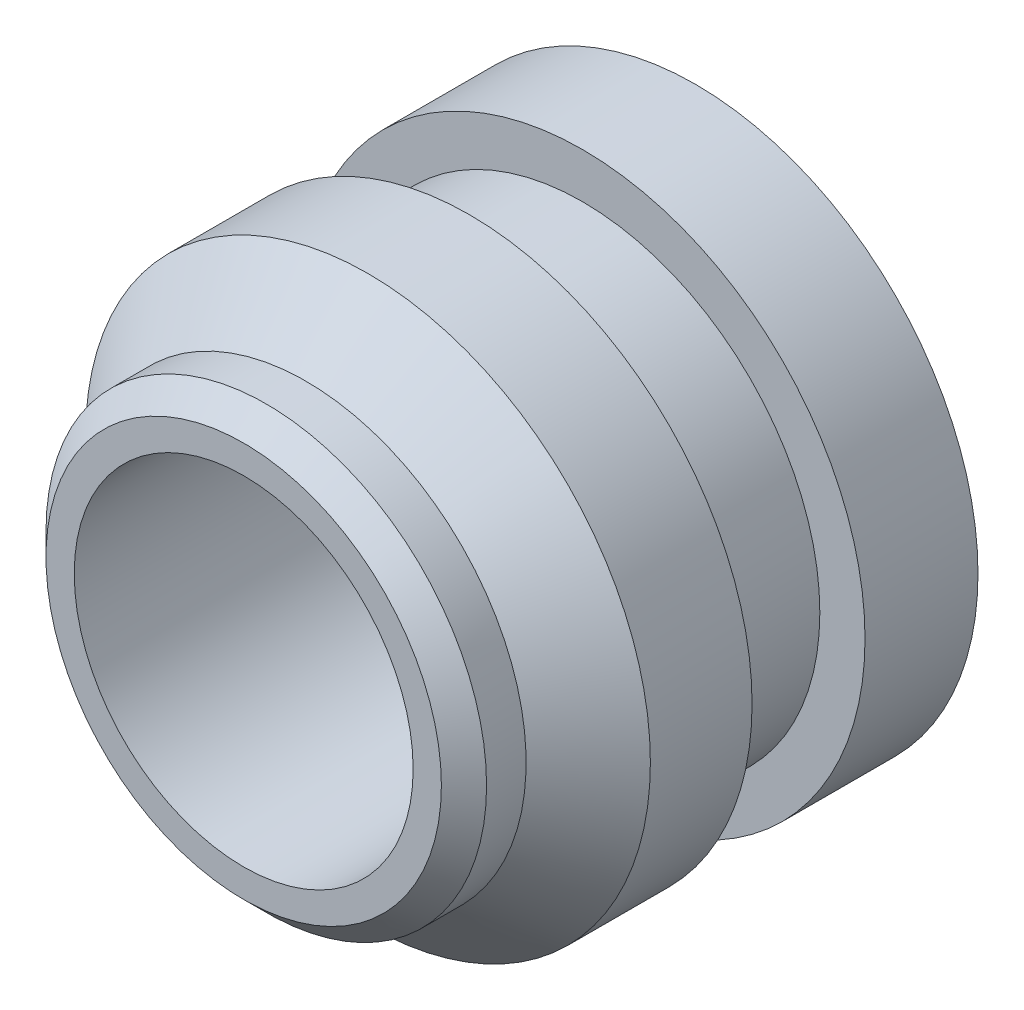
ISO-10303-21;
HEADER;
FILE_DESCRIPTION(('STEP AP214'),'2;1');
FILE_NAME('part.step','',(''),(''),'','','');
FILE_SCHEMA(('AUTOMOTIVE_DESIGN { 1 0 10303 214 1 1 1 1 }'));
ENDSEC;
DATA;
#1=APPLICATION_CONTEXT('core data for automotive mechanical design processes');
#2=APPLICATION_PROTOCOL_DEFINITION('international standard','automotive_design',2000,#1);
#3=PRODUCT_CONTEXT('',#1,'mechanical');
#4=PRODUCT('Part','Part','',(#3));
#5=PRODUCT_RELATED_PRODUCT_CATEGORY('part','',(#4));
#6=PRODUCT_DEFINITION_FORMATION('','',#4);
#7=PRODUCT_DEFINITION_CONTEXT('part definition',#1,'design');
#8=PRODUCT_DEFINITION('design','',#6,#7);
#9=PRODUCT_DEFINITION_SHAPE('','',#8);
#10=(LENGTH_UNIT() NAMED_UNIT(*) SI_UNIT(.MILLI.,.METRE.));
#11=(NAMED_UNIT(*) PLANE_ANGLE_UNIT() SI_UNIT($,.RADIAN.));
#12=(NAMED_UNIT(*) SI_UNIT($,.STERADIAN.) SOLID_ANGLE_UNIT());
#13=UNCERTAINTY_MEASURE_WITH_UNIT(LENGTH_MEASURE(1.E-05),#10,'distance_accuracy_value','');
#14=(GEOMETRIC_REPRESENTATION_CONTEXT(3) GLOBAL_UNCERTAINTY_ASSIGNED_CONTEXT((#13)) GLOBAL_UNIT_ASSIGNED_CONTEXT((#10,
#11,#12)) REPRESENTATION_CONTEXT('',''));
#15=CARTESIAN_POINT('',(0.,0.,0.));
#16=DIRECTION('',(0.,0.,1.));
#17=DIRECTION('',(1.,0.,0.));
#18=AXIS2_PLACEMENT_3D('',#15,#16,#17);
#19=CARTESIAN_POINT('',(0.,0.,1.));
#20=DIRECTION('',(0.,0.,-1.));
#21=DIRECTION('',(-1.,0.,0.));
#22=AXIS2_PLACEMENT_3D('',#19,#20,#21);
#23=CYLINDRICAL_SURFACE('',#22,2.5);
#24=CARTESIAN_POINT('',(0.,0.,1.));
#25=DIRECTION('',(0.,0.,1.));
#26=DIRECTION('',(1.,0.,0.));
#27=AXIS2_PLACEMENT_3D('',#24,#25,#26);
#28=CIRCLE('',#27,2.5);
#29=CARTESIAN_POINT('',(2.5,0.,1.));
#30=VERTEX_POINT('',#29);
#31=EDGE_CURVE('E41',#30,#30,#28,.T.);
#32=ORIENTED_EDGE('',*,*,#31,.F.);
#33=EDGE_LOOP('',(#32));
#34=FACE_BOUND('',#33,.T.);
#35=CARTESIAN_POINT('',(0.,0.,0.));
#36=DIRECTION('',(0.,0.,1.));
#37=DIRECTION('',(1.,0.,0.));
#38=AXIS2_PLACEMENT_3D('',#35,#36,#37);
#39=CIRCLE('',#38,2.5);
#40=CARTESIAN_POINT('',(2.5,0.,0.));
#41=VERTEX_POINT('',#40);
#42=EDGE_CURVE('E45',#41,#41,#39,.T.);
#43=ORIENTED_EDGE('',*,*,#42,.T.);
#44=EDGE_LOOP('',(#43));
#45=FACE_BOUND('',#44,.T.);
#46=ADVANCED_FACE('F15',(#34,#45),#23,.T.);
#47=CARTESIAN_POINT('',(0.,0.,1.));
#48=DIRECTION('',(0.,0.,1.));
#49=DIRECTION('',(1.,0.,0.));
#50=AXIS2_PLACEMENT_3D('',#47,#48,#49);
#51=PLANE('',#50);
#52=CARTESIAN_POINT('',(0.,0.,1.));
#53=DIRECTION('',(0.,0.,1.));
#54=DIRECTION('',(1.,0.,0.));
#55=AXIS2_PLACEMENT_3D('',#52,#53,#54);
#56=CIRCLE('',#55,2.1);
#57=CARTESIAN_POINT('',(2.1,0.,1.));
#58=VERTEX_POINT('',#57);
#59=EDGE_CURVE('E48',#58,#58,#56,.T.);
#60=ORIENTED_EDGE('',*,*,#59,.F.);
#61=EDGE_LOOP('',(#60));
#62=FACE_BOUND('',#61,.T.);
#63=ORIENTED_EDGE('',*,*,#31,.T.);
#64=EDGE_LOOP('',(#63));
#65=FACE_BOUND('',#64,.T.);
#66=ADVANCED_FACE('F78',(#62,#65),#51,.T.);
#67=CARTESIAN_POINT('',(0.,0.,0.));
#68=DIRECTION('',(0.,0.,1.));
#69=DIRECTION('',(1.,0.,0.));
#70=AXIS2_PLACEMENT_3D('',#67,#68,#69);
#71=PLANE('',#70);
#72=CARTESIAN_POINT('',(0.,0.,0.));
#73=DIRECTION('',(0.,0.,1.));
#74=DIRECTION('',(1.,0.,0.));
#75=AXIS2_PLACEMENT_3D('',#72,#73,#74);
#76=CIRCLE('',#75,2.07735026918962);
#77=CARTESIAN_POINT('',(2.07735026918962,0.,0.));
#78=VERTEX_POINT('',#77);
#79=EDGE_CURVE('E22',#78,#78,#76,.T.);
#80=ORIENTED_EDGE('',*,*,#79,.T.);
#81=EDGE_LOOP('',(#80));
#82=FACE_BOUND('',#81,.T.);
#83=ORIENTED_EDGE('',*,*,#42,.F.);
#84=EDGE_LOOP('',(#83));
#85=FACE_BOUND('',#84,.T.);
#86=ADVANCED_FACE('F88',(#82,#85),#71,.F.);
#87=CARTESIAN_POINT('',(0.,0.,2.));
#88=DIRECTION('',(0.,0.,-1.));
#89=DIRECTION('',(-1.,0.,0.));
#90=AXIS2_PLACEMENT_3D('',#87,#88,#89);
#91=CYLINDRICAL_SURFACE('',#90,2.1);
#92=CARTESIAN_POINT('',(0.,0.,2.));
#93=DIRECTION('',(0.,0.,1.));
#94=DIRECTION('',(1.,0.,0.));
#95=AXIS2_PLACEMENT_3D('',#92,#93,#94);
#96=CIRCLE('',#95,2.1);
#97=CARTESIAN_POINT('',(2.1,0.,2.));
#98=VERTEX_POINT('',#97);
#99=EDGE_CURVE('E44',#98,#98,#96,.T.);
#100=ORIENTED_EDGE('',*,*,#99,.F.);
#101=EDGE_LOOP('',(#100));
#102=FACE_BOUND('',#101,.T.);
#103=ORIENTED_EDGE('',*,*,#59,.T.);
#104=EDGE_LOOP('',(#103));
#105=FACE_BOUND('',#104,.T.);
#106=ADVANCED_FACE('F111',(#102,#105),#91,.T.);
#107=CARTESIAN_POINT('',(0.,0.,3.5));
#108=DIRECTION('',(0.,0.,-1.));
#109=DIRECTION('',(-1.,0.,0.));
#110=AXIS2_PLACEMENT_3D('',#107,#108,#109);
#111=CYLINDRICAL_SURFACE('',#110,2.5);
#112=CARTESIAN_POINT('',(0.,0.,2.9));
#113=DIRECTION('',(0.,0.,1.));
#114=DIRECTION('',(1.,0.,0.));
#115=AXIS2_PLACEMENT_3D('',#112,#113,#114);
#116=CIRCLE('',#115,2.5);
#117=CARTESIAN_POINT('',(2.5,0.,2.9));
#118=VERTEX_POINT('',#117);
#119=EDGE_CURVE('E28',#118,#118,#116,.F.);
#120=ORIENTED_EDGE('',*,*,#119,.T.);
#121=EDGE_LOOP('',(#120));
#122=FACE_BOUND('',#121,.T.);
#123=CARTESIAN_POINT('',(0.,0.,2.));
#124=DIRECTION('',(0.,0.,1.));
#125=DIRECTION('',(1.,0.,0.));
#126=AXIS2_PLACEMENT_3D('',#123,#124,#125);
#127=CIRCLE('',#126,2.5);
#128=CARTESIAN_POINT('',(2.5,0.,2.));
#129=VERTEX_POINT('',#128);
#130=EDGE_CURVE('E51',#129,#129,#127,.T.);
#131=ORIENTED_EDGE('',*,*,#130,.T.);
#132=EDGE_LOOP('',(#131));
#133=FACE_BOUND('',#132,.T.);
#134=ADVANCED_FACE('F112',(#122,#133),#111,.T.);
#135=CARTESIAN_POINT('',(0.,0.,2.));
#136=DIRECTION('',(0.,0.,1.));
#137=DIRECTION('',(1.,0.,0.));
#138=AXIS2_PLACEMENT_3D('',#135,#136,#137);
#139=PLANE('',#138);
#140=ORIENTED_EDGE('',*,*,#99,.T.);
#141=EDGE_LOOP('',(#140));
#142=FACE_BOUND('',#141,.T.);
#143=ORIENTED_EDGE('',*,*,#130,.F.);
#144=EDGE_LOOP('',(#143));
#145=FACE_BOUND('',#144,.T.);
#146=ADVANCED_FACE('F74',(#142,#145),#139,.F.);
#147=CARTESIAN_POINT('',(0.,0.,4.));
#148=DIRECTION('',(0.,0.,-1.));
#149=DIRECTION('',(-1.,0.,0.));
#150=AXIS2_PLACEMENT_3D('',#147,#148,#149);
#151=CYLINDRICAL_SURFACE('',#150,1.95);
#152=CARTESIAN_POINT('',(0.,0.,3.45));
#153=DIRECTION('',(0.,0.,-1.));
#154=DIRECTION('',(-1.,0.,0.));
#155=AXIS2_PLACEMENT_3D('',#152,#153,#154);
#156=CIRCLE('',#155,1.95);
#157=CARTESIAN_POINT('',(-1.95,0.,3.45));
#158=VERTEX_POINT('',#157);
#159=EDGE_CURVE('E27',#158,#158,#156,.F.);
#160=ORIENTED_EDGE('',*,*,#159,.T.);
#161=EDGE_LOOP('',(#160));
#162=FACE_BOUND('',#161,.T.);
#163=CARTESIAN_POINT('',(0.,0.,3.8));
#164=DIRECTION('',(0.,0.,1.));
#165=DIRECTION('',(1.,0.,0.));
#166=AXIS2_PLACEMENT_3D('',#163,#164,#165);
#167=CIRCLE('',#166,1.95);
#168=CARTESIAN_POINT('',(1.95,0.,3.8));
#169=VERTEX_POINT('',#168);
#170=EDGE_CURVE('E34',#169,#169,#167,.F.);
#171=ORIENTED_EDGE('',*,*,#170,.T.);
#172=EDGE_LOOP('',(#171));
#173=FACE_BOUND('',#172,.T.);
#174=ADVANCED_FACE('F63',(#162,#173),#151,.T.);
#175=CARTESIAN_POINT('',(0.,0.,4.));
#176=DIRECTION('',(0.,0.,1.));
#177=DIRECTION('',(1.,0.,0.));
#178=AXIS2_PLACEMENT_3D('',#175,#176,#177);
#179=PLANE('',#178);
#180=CARTESIAN_POINT('',(0.,0.,4.));
#181=DIRECTION('',(0.,0.,1.));
#182=DIRECTION('',(1.,0.,0.));
#183=AXIS2_PLACEMENT_3D('',#180,#181,#182);
#184=CIRCLE('',#183,1.75);
#185=CARTESIAN_POINT('',(1.75,0.,4.));
#186=VERTEX_POINT('',#185);
#187=EDGE_CURVE('E36',#186,#186,#184,.T.);
#188=ORIENTED_EDGE('',*,*,#187,.T.);
#189=EDGE_LOOP('',(#188));
#190=FACE_BOUND('',#189,.T.);
#191=CARTESIAN_POINT('',(0.,0.,4.));
#192=DIRECTION('',(0.,0.,1.));
#193=DIRECTION('',(1.,0.,0.));
#194=AXIS2_PLACEMENT_3D('',#191,#192,#193);
#195=CIRCLE('',#194,1.5);
#196=CARTESIAN_POINT('',(1.5,0.,4.));
#197=VERTEX_POINT('',#196);
#198=EDGE_CURVE('E57',#197,#197,#195,.T.);
#199=ORIENTED_EDGE('',*,*,#198,.F.);
#200=EDGE_LOOP('',(#199));
#201=FACE_BOUND('',#200,.T.);
#202=ADVANCED_FACE('F62',(#190,#201),#179,.T.);
#203=CARTESIAN_POINT('',(0.,0.,0.));
#204=DIRECTION('',(0.,0.,1.));
#205=DIRECTION('',(1.,0.,0.));
#206=AXIS2_PLACEMENT_3D('',#203,#204,#205);
#207=CYLINDRICAL_SURFACE('',#206,1.5);
#208=CARTESIAN_POINT('',(0.,0.,1.));
#209=DIRECTION('',(0.,0.,1.));
#210=DIRECTION('',(1.,0.,0.));
#211=AXIS2_PLACEMENT_3D('',#208,#209,#210);
#212=CIRCLE('',#211,1.5);
#213=CARTESIAN_POINT('',(1.5,0.,1.));
#214=VERTEX_POINT('',#213);
#215=EDGE_CURVE('E10',#214,#214,#212,.F.);
#216=ORIENTED_EDGE('',*,*,#215,.T.);
#217=EDGE_LOOP('',(#216));
#218=FACE_BOUND('',#217,.T.);
#219=ORIENTED_EDGE('',*,*,#198,.T.);
#220=EDGE_LOOP('',(#219));
#221=FACE_BOUND('',#220,.T.);
#222=ADVANCED_FACE('F58',(#218,#221),#207,.F.);
#223=CARTESIAN_POINT('',(0.,0.,4.));
#224=DIRECTION('',(0.,0.,-1.));
#225=DIRECTION('',(-1.,0.,0.));
#226=AXIS2_PLACEMENT_3D('',#223,#224,#225);
#227=CONICAL_SURFACE('',#226,1.75,0.785398163397446);
#228=ORIENTED_EDGE('',*,*,#170,.F.);
#229=EDGE_LOOP('',(#228));
#230=FACE_BOUND('',#229,.T.);
#231=ORIENTED_EDGE('',*,*,#187,.F.);
#232=EDGE_LOOP('',(#231));
#233=FACE_BOUND('',#232,.T.);
#234=ADVANCED_FACE('F73',(#230,#233),#227,.T.);
#235=CARTESIAN_POINT('',(0.,0.,3.5));
#236=DIRECTION('',(0.,0.,-1.));
#237=DIRECTION('',(-1.,0.,0.));
#238=AXIS2_PLACEMENT_3D('',#235,#236,#237);
#239=CONICAL_SURFACE('',#238,1.9,0.785398163397453);
#240=ORIENTED_EDGE('',*,*,#119,.F.);
#241=EDGE_LOOP('',(#240));
#242=FACE_BOUND('',#241,.T.);
#243=ORIENTED_EDGE('',*,*,#159,.F.);
#244=EDGE_LOOP('',(#243));
#245=FACE_BOUND('',#244,.T.);
#246=ADVANCED_FACE('F94',(#242,#245),#239,.T.);
#247=CARTESIAN_POINT('',(0.,0.,0.));
#248=DIRECTION('',(0.,0.,-1.));
#249=DIRECTION('',(-1.,0.,0.));
#250=AXIS2_PLACEMENT_3D('',#247,#248,#249);
#251=CONICAL_SURFACE('',#250,2.07735026918962,0.523598775598298);
#252=ORIENTED_EDGE('',*,*,#215,.F.);
#253=EDGE_LOOP('',(#252));
#254=FACE_BOUND('',#253,.T.);
#255=ORIENTED_EDGE('',*,*,#79,.F.);
#256=EDGE_LOOP('',(#255));
#257=FACE_BOUND('',#256,.T.);
#258=ADVANCED_FACE('F17',(#254,#257),#251,.F.);
#259=CLOSED_SHELL('',(#46,#66,#86,#106,#134,#146,#174,#202,#222,#234,#246,#258));
#260=MANIFOLD_SOLID_BREP('B1',#259);
#261=ADVANCED_BREP_SHAPE_REPRESENTATION('',(#18,#260),#14);
#262=SHAPE_DEFINITION_REPRESENTATION(#9,#261);
ENDSEC;
END-ISO-10303-21;
